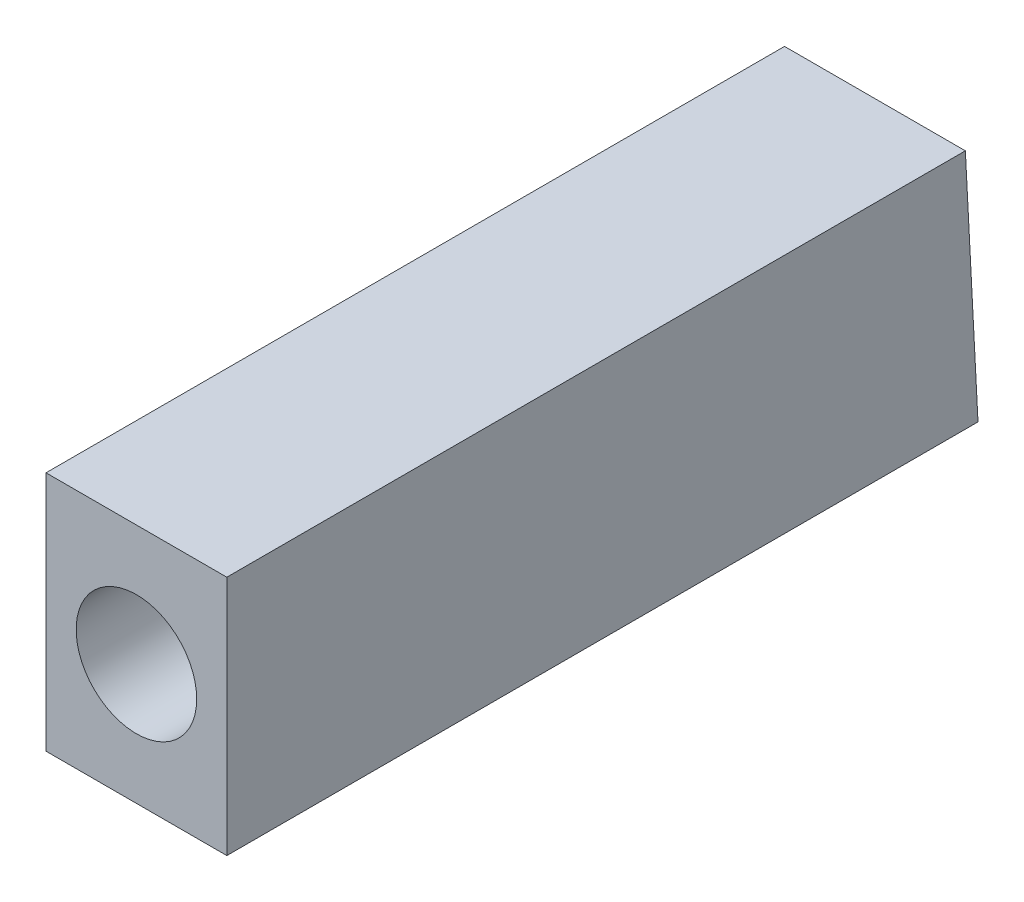
ISO-10303-21;
HEADER;
FILE_DESCRIPTION(('STEP AP214'),'2;1');
FILE_NAME('part.step','',(''),(''),'','','');
FILE_SCHEMA(('AUTOMOTIVE_DESIGN { 1 0 10303 214 1 1 1 1 }'));
ENDSEC;
DATA;
#1=APPLICATION_CONTEXT('core data for automotive mechanical design processes');
#2=APPLICATION_PROTOCOL_DEFINITION('international standard','automotive_design',2000,#1);
#3=PRODUCT_CONTEXT('',#1,'mechanical');
#4=PRODUCT('Part','Part','',(#3));
#5=PRODUCT_RELATED_PRODUCT_CATEGORY('part','',(#4));
#6=PRODUCT_DEFINITION_FORMATION('','',#4);
#7=PRODUCT_DEFINITION_CONTEXT('part definition',#1,'design');
#8=PRODUCT_DEFINITION('design','',#6,#7);
#9=PRODUCT_DEFINITION_SHAPE('','',#8);
#10=(LENGTH_UNIT() NAMED_UNIT(*) SI_UNIT(.MILLI.,.METRE.));
#11=(NAMED_UNIT(*) PLANE_ANGLE_UNIT() SI_UNIT($,.RADIAN.));
#12=(NAMED_UNIT(*) SI_UNIT($,.STERADIAN.) SOLID_ANGLE_UNIT());
#13=UNCERTAINTY_MEASURE_WITH_UNIT(LENGTH_MEASURE(1.E-05),#10,'distance_accuracy_value','');
#14=(GEOMETRIC_REPRESENTATION_CONTEXT(3) GLOBAL_UNCERTAINTY_ASSIGNED_CONTEXT((#13)) GLOBAL_UNIT_ASSIGNED_CONTEXT((#10,
#11,#12)) REPRESENTATION_CONTEXT('',''));
#15=CARTESIAN_POINT('',(0.,0.,0.));
#16=DIRECTION('',(0.,0.,1.));
#17=DIRECTION('',(1.,0.,0.));
#18=AXIS2_PLACEMENT_3D('',#15,#16,#17);
#19=CARTESIAN_POINT('',(77.,-28.,0.));
#20=DIRECTION('',(0.,1.,0.));
#21=DIRECTION('',(0.,0.,1.));
#22=AXIS2_PLACEMENT_3D('',#19,#20,#21);
#23=PLANE('',#22);
#24=DIRECTION('',(0.,0.,-1.));
#25=VECTOR('',#24,1.);
#26=CARTESIAN_POINT('',(68.,-28.,0.));
#27=LINE('',#26,#25);
#28=CARTESIAN_POINT('',(68.,-28.,-55.0000000000002));
#29=VERTEX_POINT('',#28);
#30=CARTESIAN_POINT('',(68.,-28.,-91.7564635276594));
#31=VERTEX_POINT('',#30);
#32=EDGE_CURVE('E95',#29,#31,#27,.T.);
#33=ORIENTED_EDGE('',*,*,#32,.F.);
#34=DIRECTION('',(-1.,0.,0.));
#35=VECTOR('',#34,1.);
#36=CARTESIAN_POINT('',(78.,-28.,-55.0000000000002));
#37=LINE('',#36,#35);
#38=CARTESIAN_POINT('',(77.,-28.,-55.0000000000002));
#39=VERTEX_POINT('',#38);
#40=EDGE_CURVE('E77',#39,#29,#37,.T.);
#41=ORIENTED_EDGE('',*,*,#40,.F.);
#42=DIRECTION('',(0.,0.,-1.));
#43=VECTOR('',#42,1.);
#44=CARTESIAN_POINT('',(77.,-28.,0.));
#45=LINE('',#44,#43);
#46=CARTESIAN_POINT('',(77.,-28.,-91.7564635276594));
#47=VERTEX_POINT('',#46);
#48=EDGE_CURVE('E57',#39,#47,#45,.T.);
#49=ORIENTED_EDGE('',*,*,#48,.T.);
#50=DIRECTION('',(-1.,0.,0.));
#51=VECTOR('',#50,1.);
#52=CARTESIAN_POINT('',(78.,-28.,-91.7564635276594));
#53=LINE('',#52,#51);
#54=EDGE_CURVE('E106',#47,#31,#53,.T.);
#55=ORIENTED_EDGE('',*,*,#54,.T.);
#56=EDGE_LOOP('',(#33,#41,#49,#55));
#57=FACE_BOUND('',#56,.T.);
#58=ADVANCED_FACE('F36',(#57),#23,.T.);
#59=CARTESIAN_POINT('',(68.,-28.,0.));
#60=DIRECTION('',(-1.,0.,0.));
#61=DIRECTION('',(0.,0.,1.));
#62=AXIS2_PLACEMENT_3D('',#59,#60,#61);
#63=PLANE('',#62);
#64=DIRECTION('',(0.,0.,-1.));
#65=VECTOR('',#64,1.);
#66=CARTESIAN_POINT('',(68.,-40.,0.));
#67=LINE('',#66,#65);
#68=CARTESIAN_POINT('',(68.,-40.,-55.0000000000002));
#69=VERTEX_POINT('',#68);
#70=CARTESIAN_POINT('',(68.,-40.,-92.3853568790559));
#71=VERTEX_POINT('',#70);
#72=EDGE_CURVE('E87',#69,#71,#67,.T.);
#73=ORIENTED_EDGE('',*,*,#72,.F.);
#74=DIRECTION('',(0.,1.,0.));
#75=VECTOR('',#74,1.);
#76=CARTESIAN_POINT('',(68.,-40.,-55.0000000000002));
#77=LINE('',#76,#75);
#78=EDGE_CURVE('E75',#69,#29,#77,.T.);
#79=ORIENTED_EDGE('',*,*,#78,.T.);
#80=ORIENTED_EDGE('',*,*,#32,.T.);
#81=DIRECTION('',(0.,0.998629534754574,0.0523359562429386));
#82=VECTOR('',#81,1.);
#83=CARTESIAN_POINT('',(68.,-40.,-92.3853568790559));
#84=LINE('',#83,#82);
#85=EDGE_CURVE('E90',#71,#31,#84,.T.);
#86=ORIENTED_EDGE('',*,*,#85,.F.);
#87=EDGE_LOOP('',(#73,#79,#80,#86));
#88=FACE_BOUND('',#87,.T.);
#89=ADVANCED_FACE('F93',(#88),#63,.T.);
#90=CARTESIAN_POINT('',(77.,-40.,0.));
#91=DIRECTION('',(0.,-1.,0.));
#92=DIRECTION('',(1.,0.,0.));
#93=AXIS2_PLACEMENT_3D('',#90,#91,#92);
#94=PLANE('',#93);
#95=DIRECTION('',(0.,0.,-1.));
#96=VECTOR('',#95,1.);
#97=CARTESIAN_POINT('',(77.,-40.,0.));
#98=LINE('',#97,#96);
#99=CARTESIAN_POINT('',(77.,-40.,-55.0000000000002));
#100=VERTEX_POINT('',#99);
#101=CARTESIAN_POINT('',(77.,-40.,-92.3853568790559));
#102=VERTEX_POINT('',#101);
#103=EDGE_CURVE('E89',#100,#102,#98,.T.);
#104=ORIENTED_EDGE('',*,*,#103,.F.);
#105=DIRECTION('',(-1.,0.,0.));
#106=VECTOR('',#105,1.);
#107=CARTESIAN_POINT('',(78.,-40.,-55.0000000000002));
#108=LINE('',#107,#106);
#109=EDGE_CURVE('E50',#100,#69,#108,.T.);
#110=ORIENTED_EDGE('',*,*,#109,.T.);
#111=ORIENTED_EDGE('',*,*,#72,.T.);
#112=DIRECTION('',(-1.,0.,0.));
#113=VECTOR('',#112,1.);
#114=CARTESIAN_POINT('',(78.,-40.,-92.3853568790559));
#115=LINE('',#114,#113);
#116=EDGE_CURVE('E101',#102,#71,#115,.T.);
#117=ORIENTED_EDGE('',*,*,#116,.F.);
#118=EDGE_LOOP('',(#104,#110,#111,#117));
#119=FACE_BOUND('',#118,.T.);
#120=ADVANCED_FACE('F85',(#119),#94,.T.);
#121=CARTESIAN_POINT('',(77.,-40.,0.));
#122=DIRECTION('',(1.,0.,0.));
#123=DIRECTION('',(0.,0.,-1.));
#124=AXIS2_PLACEMENT_3D('',#121,#122,#123);
#125=PLANE('',#124);
#126=ORIENTED_EDGE('',*,*,#48,.F.);
#127=DIRECTION('',(0.,-1.,0.));
#128=VECTOR('',#127,1.);
#129=CARTESIAN_POINT('',(77.,-40.0000000000003,-55.0000000000002));
#130=LINE('',#129,#128);
#131=EDGE_CURVE('E11',#39,#100,#130,.T.);
#132=ORIENTED_EDGE('',*,*,#131,.T.);
#133=ORIENTED_EDGE('',*,*,#103,.T.);
#134=DIRECTION('',(0.,-0.998629534754574,-0.0523359562429386));
#135=VECTOR('',#134,1.);
#136=CARTESIAN_POINT('',(77.,-35.1715503084998,-92.1323085533445));
#137=LINE('',#136,#135);
#138=EDGE_CURVE('E43',#47,#102,#137,.T.);
#139=ORIENTED_EDGE('',*,*,#138,.F.);
#140=EDGE_LOOP('',(#126,#132,#133,#139));
#141=FACE_BOUND('',#140,.T.);
#142=ADVANCED_FACE('F131',(#141),#125,.T.);
#143=CARTESIAN_POINT('',(78.,-40.,-92.3853568790559));
#144=DIRECTION('',(0.,-0.0523359562429386,0.998629534754574));
#145=DIRECTION('',(0.,-0.998629534754574,-0.0523359562429386));
#146=AXIS2_PLACEMENT_3D('',#143,#144,#145);
#147=PLANE('',#146);
#148=ORIENTED_EDGE('',*,*,#138,.T.);
#149=ORIENTED_EDGE('',*,*,#116,.T.);
#150=ORIENTED_EDGE('',*,*,#85,.T.);
#151=ORIENTED_EDGE('',*,*,#54,.F.);
#152=EDGE_LOOP('',(#148,#149,#150,#151));
#153=FACE_BOUND('',#152,.T.);
#154=ADVANCED_FACE('F105',(#153),#147,.F.);
#155=CARTESIAN_POINT('',(78.,-40.,-55.0000000000002));
#156=DIRECTION('',(0.,0.,1.));
#157=DIRECTION('',(0.,-1.,0.));
#158=AXIS2_PLACEMENT_3D('',#155,#156,#157);
#159=PLANE('',#158);
#160=CARTESIAN_POINT('',(72.5,-34.,-55.0000000000003));
#161=DIRECTION('',(0.,0.,1.));
#162=DIRECTION('',(1.,0.,0.));
#163=AXIS2_PLACEMENT_3D('',#160,#161,#162);
#164=CIRCLE('',#163,3.00000000000001);
#165=CARTESIAN_POINT('',(75.5,-34.,-55.0000000000003));
#166=VERTEX_POINT('',#165);
#167=EDGE_CURVE('E112',#166,#166,#164,.T.);
#168=ORIENTED_EDGE('',*,*,#167,.F.);
#169=EDGE_LOOP('',(#168));
#170=FACE_BOUND('',#169,.T.);
#171=ORIENTED_EDGE('',*,*,#40,.T.);
#172=ORIENTED_EDGE('',*,*,#78,.F.);
#173=ORIENTED_EDGE('',*,*,#109,.F.);
#174=ORIENTED_EDGE('',*,*,#131,.F.);
#175=EDGE_LOOP('',(#171,#172,#173,#174));
#176=FACE_BOUND('',#175,.T.);
#177=ADVANCED_FACE('F76',(#170,#176),#159,.T.);
#178=CARTESIAN_POINT('',(72.5,-34.,-60.0000000000003));
#179=DIRECTION('',(0.,0.,1.));
#180=DIRECTION('',(1.,0.,0.));
#181=AXIS2_PLACEMENT_3D('',#178,#179,#180);
#182=CYLINDRICAL_SURFACE('',#181,3.00000000000001);
#183=CARTESIAN_POINT('',(72.5,-34.,-60.0000000000003));
#184=DIRECTION('',(0.,0.,1.));
#185=DIRECTION('',(1.,0.,0.));
#186=AXIS2_PLACEMENT_3D('',#183,#184,#185);
#187=CIRCLE('',#186,3.00000000000001);
#188=CARTESIAN_POINT('',(75.5,-34.,-60.0000000000003));
#189=VERTEX_POINT('',#188);
#190=EDGE_CURVE('E81',#189,#189,#187,.T.);
#191=ORIENTED_EDGE('',*,*,#190,.F.);
#192=EDGE_LOOP('',(#191));
#193=FACE_BOUND('',#192,.T.);
#194=ORIENTED_EDGE('',*,*,#167,.T.);
#195=EDGE_LOOP('',(#194));
#196=FACE_BOUND('',#195,.T.);
#197=ADVANCED_FACE('F120',(#193,#196),#182,.F.);
#198=CARTESIAN_POINT('',(72.5,-34.,-60.0000000000003));
#199=DIRECTION('',(0.,0.,1.));
#200=DIRECTION('',(1.,0.,0.));
#201=AXIS2_PLACEMENT_3D('',#198,#199,#200);
#202=PLANE('',#201);
#203=ORIENTED_EDGE('',*,*,#190,.T.);
#204=EDGE_LOOP('',(#203));
#205=FACE_BOUND('',#204,.T.);
#206=ADVANCED_FACE('F118',(#205),#202,.T.);
#207=CLOSED_SHELL('',(#58,#89,#120,#142,#154,#177,#197,#206));
#208=MANIFOLD_SOLID_BREP('B2',#207);
#209=ADVANCED_BREP_SHAPE_REPRESENTATION('',(#18,#208),#14);
#210=SHAPE_DEFINITION_REPRESENTATION(#9,#209);
ENDSEC;
END-ISO-10303-21;
